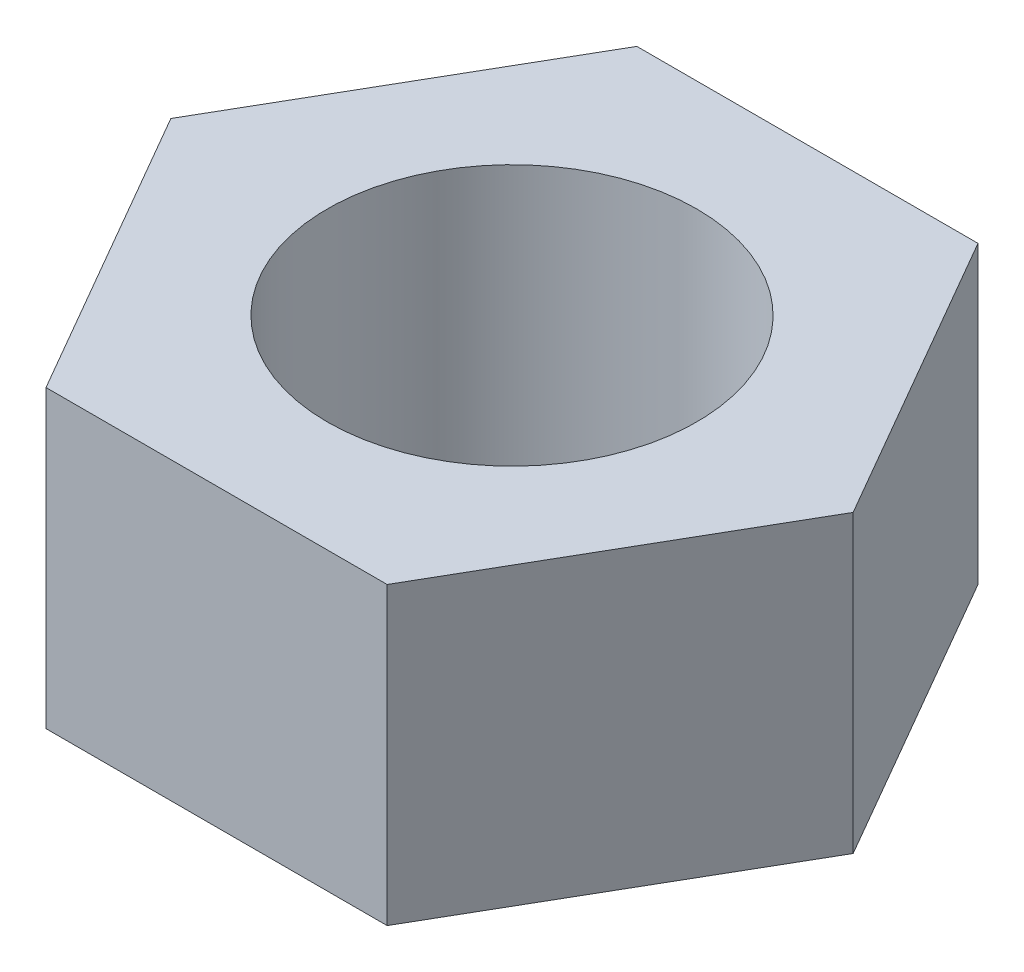
ISO-10303-21;
HEADER;
FILE_DESCRIPTION(('STEP AP214'),'2;1');
FILE_NAME('part.step','',(''),(''),'','','');
FILE_SCHEMA(('AUTOMOTIVE_DESIGN { 1 0 10303 214 1 1 1 1 }'));
ENDSEC;
DATA;
#1=APPLICATION_CONTEXT('core data for automotive mechanical design processes');
#2=APPLICATION_PROTOCOL_DEFINITION('international standard','automotive_design',2000,#1);
#3=PRODUCT_CONTEXT('',#1,'mechanical');
#4=PRODUCT('Part','Part','',(#3));
#5=PRODUCT_RELATED_PRODUCT_CATEGORY('part','',(#4));
#6=PRODUCT_DEFINITION_FORMATION('','',#4);
#7=PRODUCT_DEFINITION_CONTEXT('part definition',#1,'design');
#8=PRODUCT_DEFINITION('design','',#6,#7);
#9=PRODUCT_DEFINITION_SHAPE('','',#8);
#10=(LENGTH_UNIT() NAMED_UNIT(*) SI_UNIT(.MILLI.,.METRE.));
#11=(NAMED_UNIT(*) PLANE_ANGLE_UNIT() SI_UNIT($,.RADIAN.));
#12=(NAMED_UNIT(*) SI_UNIT($,.STERADIAN.) SOLID_ANGLE_UNIT());
#13=UNCERTAINTY_MEASURE_WITH_UNIT(LENGTH_MEASURE(1.E-05),#10,'distance_accuracy_value','');
#14=(GEOMETRIC_REPRESENTATION_CONTEXT(3) GLOBAL_UNCERTAINTY_ASSIGNED_CONTEXT((#13)) GLOBAL_UNIT_ASSIGNED_CONTEXT((#10,
#11,#12)) REPRESENTATION_CONTEXT('',''));
#15=CARTESIAN_POINT('',(0.,0.,0.));
#16=DIRECTION('',(0.,0.,1.));
#17=DIRECTION('',(1.,0.,0.));
#18=AXIS2_PLACEMENT_3D('',#15,#16,#17);
#19=CARTESIAN_POINT('',(0.,4.,0.));
#20=DIRECTION('',(0.,1.,0.));
#21=DIRECTION('',(0.,0.,1.));
#22=AXIS2_PLACEMENT_3D('',#19,#20,#21);
#23=PLANE('',#22);
#24=DIRECTION('',(0.499999999999995,0.,-0.866025403784442));
#25=VECTOR('',#24,1.);
#26=CARTESIAN_POINT('',(2.30940107675855,4.,3.99999999999998));
#27=LINE('',#26,#25);
#28=CARTESIAN_POINT('',(2.30940107675855,4.,3.99999999999998));
#29=VERTEX_POINT('',#28);
#30=CARTESIAN_POINT('',(4.61880215351701,4.,0.));
#31=VERTEX_POINT('',#30);
#32=EDGE_CURVE('E131',#29,#31,#27,.T.);
#33=ORIENTED_EDGE('',*,*,#32,.T.);
#34=DIRECTION('',(-0.500000000000001,0.,-0.866025403784438));
#35=VECTOR('',#34,1.);
#36=CARTESIAN_POINT('',(4.61880215351701,4.,0.));
#37=LINE('',#36,#35);
#38=CARTESIAN_POINT('',(2.3094010767585,4.,-4.00000000000001));
#39=VERTEX_POINT('',#38);
#40=EDGE_CURVE('E89',#31,#39,#37,.T.);
#41=ORIENTED_EDGE('',*,*,#40,.T.);
#42=DIRECTION('',(-1.,0.,0.));
#43=VECTOR('',#42,1.);
#44=CARTESIAN_POINT('',(2.3094010767585,4.,-4.00000000000001));
#45=LINE('',#44,#43);
#46=CARTESIAN_POINT('',(-2.30940107675852,4.,-3.99999999999999));
#47=VERTEX_POINT('',#46);
#48=EDGE_CURVE('E102',#39,#47,#45,.T.);
#49=ORIENTED_EDGE('',*,*,#48,.T.);
#50=DIRECTION('',(-0.499999999999995,0.,0.866025403784442));
#51=VECTOR('',#50,1.);
#52=CARTESIAN_POINT('',(-2.30940107675852,4.,-3.99999999999999));
#53=LINE('',#52,#51);
#54=CARTESIAN_POINT('',(-4.61880215351701,4.,0.));
#55=VERTEX_POINT('',#54);
#56=EDGE_CURVE('E96',#47,#55,#53,.T.);
#57=ORIENTED_EDGE('',*,*,#56,.T.);
#58=DIRECTION('',(0.500000000000007,0.,0.866025403784435));
#59=VECTOR('',#58,1.);
#60=CARTESIAN_POINT('',(-4.61880215351701,4.,0.));
#61=LINE('',#60,#59);
#62=CARTESIAN_POINT('',(-2.30940107675847,4.,4.00000000000002));
#63=VERTEX_POINT('',#62);
#64=EDGE_CURVE('E100',#55,#63,#61,.T.);
#65=ORIENTED_EDGE('',*,*,#64,.T.);
#66=DIRECTION('',(1.,0.,0.));
#67=VECTOR('',#66,1.);
#68=CARTESIAN_POINT('',(-2.30940107675847,4.,4.00000000000002));
#69=LINE('',#68,#67);
#70=EDGE_CURVE('E52',#63,#29,#69,.T.);
#71=ORIENTED_EDGE('',*,*,#70,.T.);
#72=EDGE_LOOP('',(#33,#41,#49,#57,#65,#71));
#73=FACE_BOUND('',#72,.T.);
#74=CARTESIAN_POINT('',(0.,4.,0.));
#75=DIRECTION('',(0.,1.,0.));
#76=DIRECTION('',(0.,0.,1.));
#77=AXIS2_PLACEMENT_3D('',#74,#75,#76);
#78=CIRCLE('',#77,2.5);
#79=CARTESIAN_POINT('',(0.,4.,2.5));
#80=VERTEX_POINT('',#79);
#81=EDGE_CURVE('E124',#80,#80,#78,.T.);
#82=ORIENTED_EDGE('',*,*,#81,.F.);
#83=EDGE_LOOP('',(#82));
#84=FACE_BOUND('',#83,.T.);
#85=ADVANCED_FACE('F35',(#73,#84),#23,.T.);
#86=CARTESIAN_POINT('',(0.,0.,0.));
#87=DIRECTION('',(0.,1.,0.));
#88=DIRECTION('',(0.,0.,1.));
#89=AXIS2_PLACEMENT_3D('',#86,#87,#88);
#90=PLANE('',#89);
#91=DIRECTION('',(0.499999999999995,0.,-0.866025403784442));
#92=VECTOR('',#91,1.);
#93=CARTESIAN_POINT('',(2.30940107675855,0.,3.99999999999998));
#94=LINE('',#93,#92);
#95=CARTESIAN_POINT('',(2.30940107675855,0.,3.99999999999998));
#96=VERTEX_POINT('',#95);
#97=CARTESIAN_POINT('',(4.61880215351701,0.,0.));
#98=VERTEX_POINT('',#97);
#99=EDGE_CURVE('E120',#96,#98,#94,.T.);
#100=ORIENTED_EDGE('',*,*,#99,.F.);
#101=DIRECTION('',(1.,0.,0.));
#102=VECTOR('',#101,1.);
#103=CARTESIAN_POINT('',(-2.30940107675847,0.,4.00000000000002));
#104=LINE('',#103,#102);
#105=CARTESIAN_POINT('',(-2.30940107675847,0.,4.00000000000002));
#106=VERTEX_POINT('',#105);
#107=EDGE_CURVE('E81',#106,#96,#104,.T.);
#108=ORIENTED_EDGE('',*,*,#107,.F.);
#109=DIRECTION('',(0.500000000000007,0.,0.866025403784435));
#110=VECTOR('',#109,1.);
#111=CARTESIAN_POINT('',(-4.61880215351701,0.,0.));
#112=LINE('',#111,#110);
#113=CARTESIAN_POINT('',(-4.61880215351701,0.,0.));
#114=VERTEX_POINT('',#113);
#115=EDGE_CURVE('E75',#114,#106,#112,.T.);
#116=ORIENTED_EDGE('',*,*,#115,.F.);
#117=DIRECTION('',(-0.499999999999995,0.,0.866025403784442));
#118=VECTOR('',#117,1.);
#119=CARTESIAN_POINT('',(-2.30940107675852,0.,-3.99999999999999));
#120=LINE('',#119,#118);
#121=CARTESIAN_POINT('',(-2.30940107675852,0.,-3.99999999999999));
#122=VERTEX_POINT('',#121);
#123=EDGE_CURVE('E110',#122,#114,#120,.T.);
#124=ORIENTED_EDGE('',*,*,#123,.F.);
#125=DIRECTION('',(-1.,0.,0.));
#126=VECTOR('',#125,1.);
#127=CARTESIAN_POINT('',(2.3094010767585,0.,-4.00000000000001));
#128=LINE('',#127,#126);
#129=CARTESIAN_POINT('',(2.3094010767585,0.,-4.00000000000001));
#130=VERTEX_POINT('',#129);
#131=EDGE_CURVE('E126',#130,#122,#128,.T.);
#132=ORIENTED_EDGE('',*,*,#131,.F.);
#133=DIRECTION('',(-0.500000000000001,0.,-0.866025403784438));
#134=VECTOR('',#133,1.);
#135=CARTESIAN_POINT('',(4.61880215351701,0.,0.));
#136=LINE('',#135,#134);
#137=EDGE_CURVE('E123',#98,#130,#136,.T.);
#138=ORIENTED_EDGE('',*,*,#137,.F.);
#139=EDGE_LOOP('',(#100,#108,#116,#124,#132,#138));
#140=FACE_BOUND('',#139,.T.);
#141=CARTESIAN_POINT('',(0.,0.,0.));
#142=DIRECTION('',(0.,1.,0.));
#143=DIRECTION('',(0.,0.,1.));
#144=AXIS2_PLACEMENT_3D('',#141,#142,#143);
#145=CIRCLE('',#144,2.5);
#146=CARTESIAN_POINT('',(0.,0.,2.5));
#147=VERTEX_POINT('',#146);
#148=EDGE_CURVE('E224',#147,#147,#145,.T.);
#149=ORIENTED_EDGE('',*,*,#148,.T.);
#150=EDGE_LOOP('',(#149));
#151=FACE_BOUND('',#150,.T.);
#152=ADVANCED_FACE('F140',(#140,#151),#90,.F.);
#153=CARTESIAN_POINT('',(2.30940107675855,4.,3.99999999999998));
#154=DIRECTION('',(-0.866025403784441,0.,-0.499999999999995));
#155=DIRECTION('',(-0.499999999999995,0.,0.866025403784442));
#156=AXIS2_PLACEMENT_3D('',#153,#154,#155);
#157=PLANE('',#156);
#158=ORIENTED_EDGE('',*,*,#99,.T.);
#159=DIRECTION('',(0.,-1.,0.));
#160=VECTOR('',#159,1.);
#161=CARTESIAN_POINT('',(4.61880215351701,4.,0.));
#162=LINE('',#161,#160);
#163=EDGE_CURVE('E11',#31,#98,#162,.T.);
#164=ORIENTED_EDGE('',*,*,#163,.F.);
#165=ORIENTED_EDGE('',*,*,#32,.F.);
#166=DIRECTION('',(0.,-1.,0.));
#167=VECTOR('',#166,1.);
#168=CARTESIAN_POINT('',(2.30940107675855,4.,3.99999999999998));
#169=LINE('',#168,#167);
#170=EDGE_CURVE('E116',#29,#96,#169,.T.);
#171=ORIENTED_EDGE('',*,*,#170,.T.);
#172=EDGE_LOOP('',(#158,#164,#165,#171));
#173=FACE_BOUND('',#172,.T.);
#174=ADVANCED_FACE('F37',(#173),#157,.F.);
#175=CARTESIAN_POINT('',(4.61880215351701,4.,0.));
#176=DIRECTION('',(-0.866025403784438,0.,0.500000000000001));
#177=DIRECTION('',(0.500000000000001,0.,0.866025403784438));
#178=AXIS2_PLACEMENT_3D('',#175,#176,#177);
#179=PLANE('',#178);
#180=ORIENTED_EDGE('',*,*,#137,.T.);
#181=DIRECTION('',(0.,-1.,0.));
#182=VECTOR('',#181,1.);
#183=CARTESIAN_POINT('',(2.3094010767585,4.,-4.00000000000001));
#184=LINE('',#183,#182);
#185=EDGE_CURVE('E44',#39,#130,#184,.T.);
#186=ORIENTED_EDGE('',*,*,#185,.F.);
#187=ORIENTED_EDGE('',*,*,#40,.F.);
#188=ORIENTED_EDGE('',*,*,#163,.T.);
#189=EDGE_LOOP('',(#180,#186,#187,#188));
#190=FACE_BOUND('',#189,.T.);
#191=ADVANCED_FACE('F165',(#190),#179,.F.);
#192=CARTESIAN_POINT('',(2.3094010767585,4.,-4.00000000000001));
#193=DIRECTION('',(0.,0.,1.));
#194=DIRECTION('',(1.,0.,0.));
#195=AXIS2_PLACEMENT_3D('',#192,#193,#194);
#196=PLANE('',#195);
#197=ORIENTED_EDGE('',*,*,#131,.T.);
#198=DIRECTION('',(0.,-1.,0.));
#199=VECTOR('',#198,1.);
#200=CARTESIAN_POINT('',(-2.30940107675852,4.,-3.99999999999999));
#201=LINE('',#200,#199);
#202=EDGE_CURVE('E111',#47,#122,#201,.T.);
#203=ORIENTED_EDGE('',*,*,#202,.F.);
#204=ORIENTED_EDGE('',*,*,#48,.F.);
#205=ORIENTED_EDGE('',*,*,#185,.T.);
#206=EDGE_LOOP('',(#197,#203,#204,#205));
#207=FACE_BOUND('',#206,.T.);
#208=ADVANCED_FACE('F137',(#207),#196,.F.);
#209=CARTESIAN_POINT('',(-2.30940107675852,4.,-3.99999999999999));
#210=DIRECTION('',(0.866025403784442,0.,0.499999999999995));
#211=DIRECTION('',(0.499999999999995,0.,-0.866025403784442));
#212=AXIS2_PLACEMENT_3D('',#209,#210,#211);
#213=PLANE('',#212);
#214=ORIENTED_EDGE('',*,*,#123,.T.);
#215=DIRECTION('',(0.,-1.,0.));
#216=VECTOR('',#215,1.);
#217=CARTESIAN_POINT('',(-4.61880215351701,4.,0.));
#218=LINE('',#217,#216);
#219=EDGE_CURVE('E107',#55,#114,#218,.T.);
#220=ORIENTED_EDGE('',*,*,#219,.F.);
#221=ORIENTED_EDGE('',*,*,#56,.F.);
#222=ORIENTED_EDGE('',*,*,#202,.T.);
#223=EDGE_LOOP('',(#214,#220,#221,#222));
#224=FACE_BOUND('',#223,.T.);
#225=ADVANCED_FACE('F108',(#224),#213,.F.);
#226=CARTESIAN_POINT('',(-4.61880215351701,4.,0.));
#227=DIRECTION('',(0.866025403784435,0.,-0.500000000000007));
#228=DIRECTION('',(-0.500000000000007,0.,-0.866025403784435));
#229=AXIS2_PLACEMENT_3D('',#226,#227,#228);
#230=PLANE('',#229);
#231=ORIENTED_EDGE('',*,*,#115,.T.);
#232=DIRECTION('',(0.,-1.,0.));
#233=VECTOR('',#232,1.);
#234=CARTESIAN_POINT('',(-2.30940107675847,4.,4.00000000000002));
#235=LINE('',#234,#233);
#236=EDGE_CURVE('E112',#63,#106,#235,.T.);
#237=ORIENTED_EDGE('',*,*,#236,.F.);
#238=ORIENTED_EDGE('',*,*,#64,.F.);
#239=ORIENTED_EDGE('',*,*,#219,.T.);
#240=EDGE_LOOP('',(#231,#237,#238,#239));
#241=FACE_BOUND('',#240,.T.);
#242=ADVANCED_FACE('F114',(#241),#230,.F.);
#243=CARTESIAN_POINT('',(-2.30940107675847,4.,4.00000000000002));
#244=DIRECTION('',(0.,0.,-1.));
#245=DIRECTION('',(-1.,0.,0.));
#246=AXIS2_PLACEMENT_3D('',#243,#244,#245);
#247=PLANE('',#246);
#248=ORIENTED_EDGE('',*,*,#107,.T.);
#249=ORIENTED_EDGE('',*,*,#170,.F.);
#250=ORIENTED_EDGE('',*,*,#70,.F.);
#251=ORIENTED_EDGE('',*,*,#236,.T.);
#252=EDGE_LOOP('',(#248,#249,#250,#251));
#253=FACE_BOUND('',#252,.T.);
#254=ADVANCED_FACE('F145',(#253),#247,.F.);
#255=CARTESIAN_POINT('',(0.,4.,0.));
#256=DIRECTION('',(0.,-1.,0.));
#257=DIRECTION('',(0.,0.,-1.));
#258=AXIS2_PLACEMENT_3D('',#255,#256,#257);
#259=CYLINDRICAL_SURFACE('',#258,2.5);
#260=ORIENTED_EDGE('',*,*,#81,.T.);
#261=EDGE_LOOP('',(#260));
#262=FACE_BOUND('',#261,.T.);
#263=ORIENTED_EDGE('',*,*,#148,.F.);
#264=EDGE_LOOP('',(#263));
#265=FACE_BOUND('',#264,.T.);
#266=ADVANCED_FACE('F147',(#262,#265),#259,.F.);
#267=CLOSED_SHELL('',(#85,#152,#174,#191,#208,#225,#242,#254,#266));
#268=MANIFOLD_SOLID_BREP('B2',#267);
#269=ADVANCED_BREP_SHAPE_REPRESENTATION('',(#18,#268),#14);
#270=SHAPE_DEFINITION_REPRESENTATION(#9,#269);
ENDSEC;
END-ISO-10303-21;
